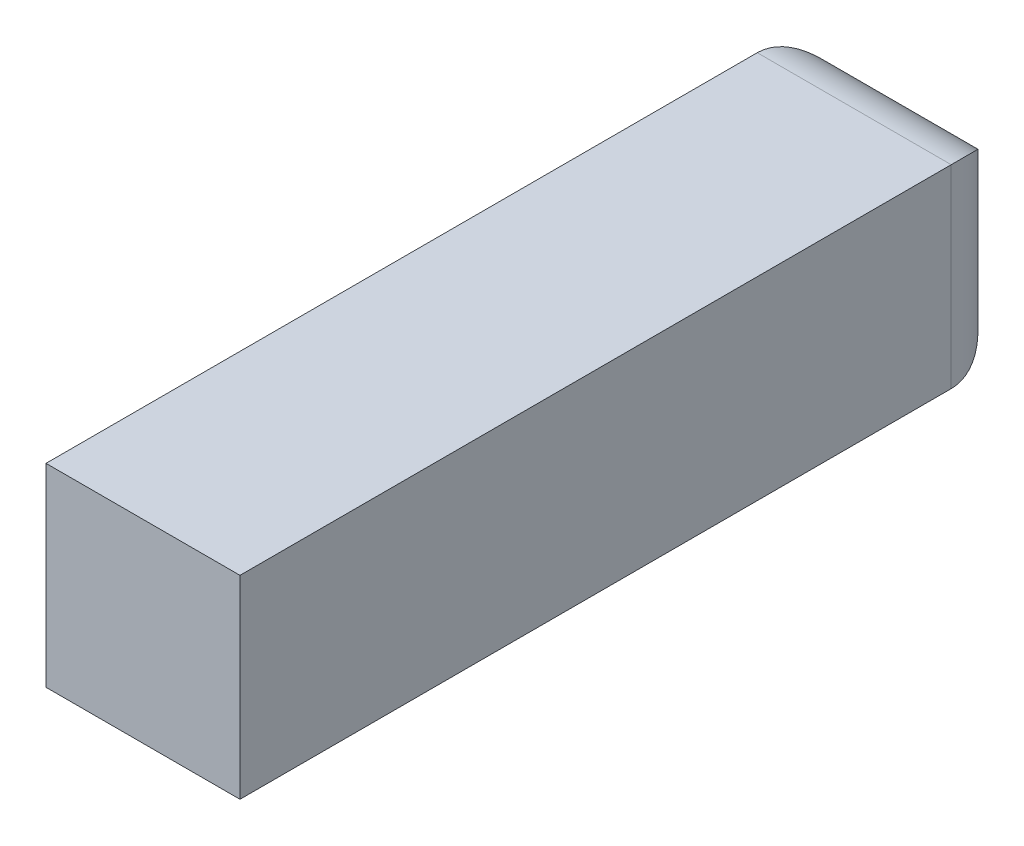
ISO-10303-21;
HEADER;
FILE_DESCRIPTION(('STEP AP214'),'2;1');
FILE_NAME('part.step','',(''),(''),'','','');
FILE_SCHEMA(('AUTOMOTIVE_DESIGN { 1 0 10303 214 1 1 1 1 }'));
ENDSEC;
DATA;
#1=APPLICATION_CONTEXT('core data for automotive mechanical design processes');
#2=APPLICATION_PROTOCOL_DEFINITION('international standard','automotive_design',2000,#1);
#3=PRODUCT_CONTEXT('',#1,'mechanical');
#4=PRODUCT('Part','Part','',(#3));
#5=PRODUCT_RELATED_PRODUCT_CATEGORY('part','',(#4));
#6=PRODUCT_DEFINITION_FORMATION('','',#4);
#7=PRODUCT_DEFINITION_CONTEXT('part definition',#1,'design');
#8=PRODUCT_DEFINITION('design','',#6,#7);
#9=PRODUCT_DEFINITION_SHAPE('','',#8);
#10=(LENGTH_UNIT() NAMED_UNIT(*) SI_UNIT(.MILLI.,.METRE.));
#11=(NAMED_UNIT(*) PLANE_ANGLE_UNIT() SI_UNIT($,.RADIAN.));
#12=(NAMED_UNIT(*) SI_UNIT($,.STERADIAN.) SOLID_ANGLE_UNIT());
#13=UNCERTAINTY_MEASURE_WITH_UNIT(LENGTH_MEASURE(1.E-05),#10,'distance_accuracy_value','');
#14=(GEOMETRIC_REPRESENTATION_CONTEXT(3) GLOBAL_UNCERTAINTY_ASSIGNED_CONTEXT((#13)) GLOBAL_UNIT_ASSIGNED_CONTEXT((#10,
#11,#12)) REPRESENTATION_CONTEXT('',''));
#15=CARTESIAN_POINT('',(0.,0.,0.));
#16=DIRECTION('',(0.,0.,1.));
#17=DIRECTION('',(1.,0.,0.));
#18=AXIS2_PLACEMENT_3D('',#15,#16,#17);
#19=CARTESIAN_POINT('',(-15.,15.,120.));
#20=DIRECTION('',(1.,0.,0.));
#21=DIRECTION('',(0.,1.,0.));
#22=AXIS2_PLACEMENT_3D('',#19,#20,#21);
#23=PLANE('',#22);
#24=DIRECTION('',(0.,0.,-1.));
#25=VECTOR('',#24,1.);
#26=CARTESIAN_POINT('',(-15.,15.,120.));
#27=LINE('',#26,#25);
#28=CARTESIAN_POINT('',(-15.,15.,120.));
#29=VERTEX_POINT('',#28);
#30=CARTESIAN_POINT('',(-15.,15.,9.99999999999999));
#31=VERTEX_POINT('',#30);
#32=EDGE_CURVE('E151',#29,#31,#27,.T.);
#33=ORIENTED_EDGE('',*,*,#32,.T.);
#34=DIRECTION('',(0.,-1.,0.));
#35=VECTOR('',#34,1.);
#36=CARTESIAN_POINT('',(-15.,15.,9.99999999999999));
#37=LINE('',#36,#35);
#38=CARTESIAN_POINT('',(-15.,-15.,9.99999999999999));
#39=VERTEX_POINT('',#38);
#40=EDGE_CURVE('E107',#31,#39,#37,.T.);
#41=ORIENTED_EDGE('',*,*,#40,.T.);
#42=DIRECTION('',(0.,0.,-1.));
#43=VECTOR('',#42,1.);
#44=CARTESIAN_POINT('',(-15.,-15.,120.));
#45=LINE('',#44,#43);
#46=CARTESIAN_POINT('',(-15.,-15.,120.));
#47=VERTEX_POINT('',#46);
#48=EDGE_CURVE('E92',#47,#39,#45,.T.);
#49=ORIENTED_EDGE('',*,*,#48,.F.);
#50=DIRECTION('',(0.,-1.,0.));
#51=VECTOR('',#50,1.);
#52=CARTESIAN_POINT('',(-15.,15.,120.));
#53=LINE('',#52,#51);
#54=EDGE_CURVE('E98',#29,#47,#53,.T.);
#55=ORIENTED_EDGE('',*,*,#54,.F.);
#56=EDGE_LOOP('',(#33,#41,#49,#55));
#57=FACE_BOUND('',#56,.T.);
#58=ADVANCED_FACE('F32',(#57),#23,.F.);
#59=CARTESIAN_POINT('',(-15.,-15.,120.));
#60=DIRECTION('',(0.,1.,0.));
#61=DIRECTION('',(-1.,0.,0.));
#62=AXIS2_PLACEMENT_3D('',#59,#60,#61);
#63=PLANE('',#62);
#64=ORIENTED_EDGE('',*,*,#48,.T.);
#65=DIRECTION('',(1.,0.,0.));
#66=VECTOR('',#65,1.);
#67=CARTESIAN_POINT('',(-15.,-15.,9.99999999999999));
#68=LINE('',#67,#66);
#69=CARTESIAN_POINT('',(15.,-15.,9.99999999999999));
#70=VERTEX_POINT('',#69);
#71=EDGE_CURVE('E108',#39,#70,#68,.T.);
#72=ORIENTED_EDGE('',*,*,#71,.T.);
#73=DIRECTION('',(0.,0.,-1.));
#74=VECTOR('',#73,1.);
#75=CARTESIAN_POINT('',(15.,-15.,120.));
#76=LINE('',#75,#74);
#77=CARTESIAN_POINT('',(15.,-15.,120.));
#78=VERTEX_POINT('',#77);
#79=EDGE_CURVE('E94',#78,#70,#76,.T.);
#80=ORIENTED_EDGE('',*,*,#79,.F.);
#81=DIRECTION('',(1.,0.,0.));
#82=VECTOR('',#81,1.);
#83=CARTESIAN_POINT('',(-15.,-15.,120.));
#84=LINE('',#83,#82);
#85=EDGE_CURVE('E87',#47,#78,#84,.T.);
#86=ORIENTED_EDGE('',*,*,#85,.F.);
#87=EDGE_LOOP('',(#64,#72,#80,#86));
#88=FACE_BOUND('',#87,.T.);
#89=ADVANCED_FACE('F89',(#88),#63,.F.);
#90=CARTESIAN_POINT('',(15.,15.,120.));
#91=DIRECTION('',(-1.,0.,0.));
#92=DIRECTION('',(0.,-1.,0.));
#93=AXIS2_PLACEMENT_3D('',#90,#91,#92);
#94=PLANE('',#93);
#95=ORIENTED_EDGE('',*,*,#79,.T.);
#96=DIRECTION('',(0.,1.,0.));
#97=VECTOR('',#96,1.);
#98=CARTESIAN_POINT('',(15.,15.,9.99999999999999));
#99=LINE('',#98,#97);
#100=CARTESIAN_POINT('',(15.,15.,9.99999999999999));
#101=VERTEX_POINT('',#100);
#102=EDGE_CURVE('E11',#70,#101,#99,.T.);
#103=ORIENTED_EDGE('',*,*,#102,.T.);
#104=DIRECTION('',(0.,0.,-1.));
#105=VECTOR('',#104,1.);
#106=CARTESIAN_POINT('',(15.,15.,120.));
#107=LINE('',#106,#105);
#108=CARTESIAN_POINT('',(15.,15.,120.));
#109=VERTEX_POINT('',#108);
#110=EDGE_CURVE('E112',#109,#101,#107,.T.);
#111=ORIENTED_EDGE('',*,*,#110,.F.);
#112=DIRECTION('',(0.,1.,0.));
#113=VECTOR('',#112,1.);
#114=CARTESIAN_POINT('',(15.,15.,120.));
#115=LINE('',#114,#113);
#116=EDGE_CURVE('E97',#78,#109,#115,.T.);
#117=ORIENTED_EDGE('',*,*,#116,.F.);
#118=EDGE_LOOP('',(#95,#103,#111,#117));
#119=FACE_BOUND('',#118,.T.);
#120=ADVANCED_FACE('F149',(#119),#94,.F.);
#121=CARTESIAN_POINT('',(-15.,15.,120.));
#122=DIRECTION('',(0.,-1.,0.));
#123=DIRECTION('',(1.,0.,0.));
#124=AXIS2_PLACEMENT_3D('',#121,#122,#123);
#125=PLANE('',#124);
#126=ORIENTED_EDGE('',*,*,#110,.T.);
#127=DIRECTION('',(-1.,0.,0.));
#128=VECTOR('',#127,1.);
#129=CARTESIAN_POINT('',(-15.,15.,9.99999999999999));
#130=LINE('',#129,#128);
#131=EDGE_CURVE('E41',#101,#31,#130,.T.);
#132=ORIENTED_EDGE('',*,*,#131,.T.);
#133=ORIENTED_EDGE('',*,*,#32,.F.);
#134=DIRECTION('',(-1.,0.,0.));
#135=VECTOR('',#134,1.);
#136=CARTESIAN_POINT('',(-15.,15.,120.));
#137=LINE('',#136,#135);
#138=EDGE_CURVE('E103',#109,#29,#137,.T.);
#139=ORIENTED_EDGE('',*,*,#138,.F.);
#140=EDGE_LOOP('',(#126,#132,#133,#139));
#141=FACE_BOUND('',#140,.T.);
#142=ADVANCED_FACE('F154',(#141),#125,.F.);
#143=CARTESIAN_POINT('',(0.,0.,120.));
#144=DIRECTION('',(0.,0.,1.));
#145=DIRECTION('',(1.,0.,0.));
#146=AXIS2_PLACEMENT_3D('',#143,#144,#145);
#147=PLANE('',#146);
#148=ORIENTED_EDGE('',*,*,#54,.T.);
#149=ORIENTED_EDGE('',*,*,#85,.T.);
#150=ORIENTED_EDGE('',*,*,#116,.T.);
#151=ORIENTED_EDGE('',*,*,#138,.T.);
#152=EDGE_LOOP('',(#148,#149,#150,#151));
#153=FACE_BOUND('',#152,.T.);
#154=ADVANCED_FACE('F101',(#153),#147,.T.);
#155=CARTESIAN_POINT('',(0.,0.,0.));
#156=DIRECTION('',(0.,0.,1.));
#157=DIRECTION('',(1.,0.,0.));
#158=AXIS2_PLACEMENT_3D('',#155,#156,#157);
#159=PLANE('',#158);
#160=DIRECTION('',(0.,1.,0.));
#161=VECTOR('',#160,1.);
#162=CARTESIAN_POINT('',(5.00000000000001,0.,0.));
#163=LINE('',#162,#161);
#164=CARTESIAN_POINT('',(5.,5.,0.));
#165=VERTEX_POINT('',#164);
#166=CARTESIAN_POINT('',(5.00000000000001,-5.,0.));
#167=VERTEX_POINT('',#166);
#168=EDGE_CURVE('E110',#165,#167,#163,.F.);
#169=ORIENTED_EDGE('',*,*,#168,.T.);
#170=DIRECTION('',(1.,0.,0.));
#171=VECTOR('',#170,1.);
#172=CARTESIAN_POINT('',(0.,-5.,0.));
#173=LINE('',#172,#171);
#174=CARTESIAN_POINT('',(-5.,-5.,0.));
#175=VERTEX_POINT('',#174);
#176=EDGE_CURVE('E121',#167,#175,#173,.F.);
#177=ORIENTED_EDGE('',*,*,#176,.T.);
#178=DIRECTION('',(0.,-1.,0.));
#179=VECTOR('',#178,1.);
#180=CARTESIAN_POINT('',(-5.,0.,0.));
#181=LINE('',#180,#179);
#182=CARTESIAN_POINT('',(-5.,5.,0.));
#183=VERTEX_POINT('',#182);
#184=EDGE_CURVE('E119',#175,#183,#181,.F.);
#185=ORIENTED_EDGE('',*,*,#184,.T.);
#186=DIRECTION('',(-1.,0.,0.));
#187=VECTOR('',#186,1.);
#188=CARTESIAN_POINT('',(0.,5.,0.));
#189=LINE('',#188,#187);
#190=EDGE_CURVE('E117',#183,#165,#189,.F.);
#191=ORIENTED_EDGE('',*,*,#190,.T.);
#192=EDGE_LOOP('',(#169,#177,#185,#191));
#193=FACE_BOUND('',#192,.T.);
#194=ADVANCED_FACE('F142',(#193),#159,.F.);
#195=CARTESIAN_POINT('',(-15.,5.,9.99999999999999));
#196=DIRECTION('',(-1.,0.,0.));
#197=DIRECTION('',(0.,-1.,0.));
#198=AXIS2_PLACEMENT_3D('',#195,#196,#197);
#199=CYLINDRICAL_SURFACE('',#198,10.);
#200=CARTESIAN_POINT('',(5.,5.,9.99999999999999));
#201=DIRECTION('',(-0.707106781186548,0.707106781186547,0.));
#202=DIRECTION('',(0.707106781186547,0.707106781186548,0.));
#203=AXIS2_PLACEMENT_3D('',#200,#201,#202);
#204=ELLIPSE('',#203,14.1421356237309,10.);
#205=EDGE_CURVE('E129',#165,#101,#204,.F.);
#206=ORIENTED_EDGE('',*,*,#205,.F.);
#207=ORIENTED_EDGE('',*,*,#190,.F.);
#208=CARTESIAN_POINT('',(-5.,5.,9.99999999999999));
#209=DIRECTION('',(-0.707106781186547,-0.707106781186547,0.));
#210=DIRECTION('',(-0.707106781186547,0.707106781186547,0.));
#211=AXIS2_PLACEMENT_3D('',#208,#209,#210);
#212=ELLIPSE('',#211,14.1421356237309,10.);
#213=EDGE_CURVE('E36',#31,#183,#212,.T.);
#214=ORIENTED_EDGE('',*,*,#213,.F.);
#215=ORIENTED_EDGE('',*,*,#131,.F.);
#216=EDGE_LOOP('',(#206,#207,#214,#215));
#217=FACE_BOUND('',#216,.T.);
#218=ADVANCED_FACE('F34',(#217),#199,.T.);
#219=CARTESIAN_POINT('',(-5.,15.,9.99999999999999));
#220=DIRECTION('',(0.,-1.,0.));
#221=DIRECTION('',(1.,0.,0.));
#222=AXIS2_PLACEMENT_3D('',#219,#220,#221);
#223=CYLINDRICAL_SURFACE('',#222,10.);
#224=ORIENTED_EDGE('',*,*,#213,.T.);
#225=ORIENTED_EDGE('',*,*,#184,.F.);
#226=CARTESIAN_POINT('',(-5.,-5.,9.99999999999999));
#227=DIRECTION('',(0.707106781186547,-0.707106781186547,0.));
#228=DIRECTION('',(-0.707106781186547,-0.707106781186548,0.));
#229=AXIS2_PLACEMENT_3D('',#226,#227,#228);
#230=ELLIPSE('',#229,14.142135623731,10.);
#231=EDGE_CURVE('E128',#39,#175,#230,.T.);
#232=ORIENTED_EDGE('',*,*,#231,.F.);
#233=ORIENTED_EDGE('',*,*,#40,.F.);
#234=EDGE_LOOP('',(#224,#225,#232,#233));
#235=FACE_BOUND('',#234,.T.);
#236=ADVANCED_FACE('F138',(#235),#223,.T.);
#237=CARTESIAN_POINT('',(5.,15.,9.99999999999999));
#238=DIRECTION('',(0.,1.,0.));
#239=DIRECTION('',(-1.,0.,0.));
#240=AXIS2_PLACEMENT_3D('',#237,#238,#239);
#241=CYLINDRICAL_SURFACE('',#240,10.);
#242=ORIENTED_EDGE('',*,*,#205,.T.);
#243=ORIENTED_EDGE('',*,*,#102,.F.);
#244=CARTESIAN_POINT('',(5.00000000000001,-5.,9.99999999999999));
#245=DIRECTION('',(0.707106781186547,0.707106781186548,0.));
#246=DIRECTION('',(-0.707106781186548,0.707106781186547,0.));
#247=AXIS2_PLACEMENT_3D('',#244,#245,#246);
#248=ELLIPSE('',#247,14.142135623731,10.);
#249=EDGE_CURVE('E126',#167,#70,#248,.F.);
#250=ORIENTED_EDGE('',*,*,#249,.F.);
#251=ORIENTED_EDGE('',*,*,#168,.F.);
#252=EDGE_LOOP('',(#242,#243,#250,#251));
#253=FACE_BOUND('',#252,.T.);
#254=ADVANCED_FACE('F148',(#253),#241,.T.);
#255=CARTESIAN_POINT('',(-15.,-5.,9.99999999999999));
#256=DIRECTION('',(1.,0.,0.));
#257=DIRECTION('',(0.,1.,0.));
#258=AXIS2_PLACEMENT_3D('',#255,#256,#257);
#259=CYLINDRICAL_SURFACE('',#258,10.);
#260=ORIENTED_EDGE('',*,*,#231,.T.);
#261=ORIENTED_EDGE('',*,*,#176,.F.);
#262=ORIENTED_EDGE('',*,*,#249,.T.);
#263=ORIENTED_EDGE('',*,*,#71,.F.);
#264=EDGE_LOOP('',(#260,#261,#262,#263));
#265=FACE_BOUND('',#264,.T.);
#266=ADVANCED_FACE('F146',(#265),#259,.T.);
#267=CLOSED_SHELL('',(#58,#89,#120,#142,#154,#194,#218,#236,#254,#266));
#268=MANIFOLD_SOLID_BREP('B2',#267);
#269=ADVANCED_BREP_SHAPE_REPRESENTATION('',(#18,#268),#14);
#270=SHAPE_DEFINITION_REPRESENTATION(#9,#269);
ENDSEC;
END-ISO-10303-21;
